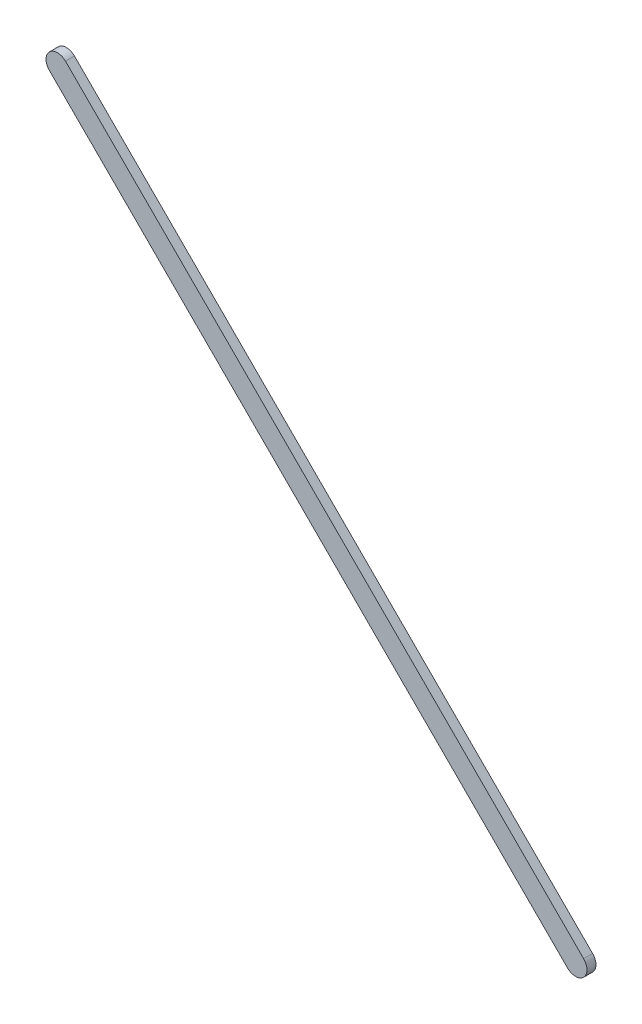
ISO-10303-21;
HEADER;
FILE_DESCRIPTION(('STEP AP214'),'2;1');
FILE_NAME('part.step','',(''),(''),'','','');
FILE_SCHEMA(('AUTOMOTIVE_DESIGN { 1 0 10303 214 1 1 1 1 }'));
ENDSEC;
DATA;
#1=APPLICATION_CONTEXT('core data for automotive mechanical design processes');
#2=APPLICATION_PROTOCOL_DEFINITION('international standard','automotive_design',2000,#1);
#3=PRODUCT_CONTEXT('',#1,'mechanical');
#4=PRODUCT('Part','Part','',(#3));
#5=PRODUCT_RELATED_PRODUCT_CATEGORY('part','',(#4));
#6=PRODUCT_DEFINITION_FORMATION('','',#4);
#7=PRODUCT_DEFINITION_CONTEXT('part definition',#1,'design');
#8=PRODUCT_DEFINITION('design','',#6,#7);
#9=PRODUCT_DEFINITION_SHAPE('','',#8);
#10=(LENGTH_UNIT() NAMED_UNIT(*) SI_UNIT(.MILLI.,.METRE.));
#11=(NAMED_UNIT(*) PLANE_ANGLE_UNIT() SI_UNIT($,.RADIAN.));
#12=(NAMED_UNIT(*) SI_UNIT($,.STERADIAN.) SOLID_ANGLE_UNIT());
#13=UNCERTAINTY_MEASURE_WITH_UNIT(LENGTH_MEASURE(1.E-05),#10,'distance_accuracy_value','');
#14=(GEOMETRIC_REPRESENTATION_CONTEXT(3) GLOBAL_UNCERTAINTY_ASSIGNED_CONTEXT((#13)) GLOBAL_UNIT_ASSIGNED_CONTEXT((#10,
#11,#12)) REPRESENTATION_CONTEXT('',''));
#15=CARTESIAN_POINT('',(0.,0.,0.));
#16=DIRECTION('',(0.,0.,1.));
#17=DIRECTION('',(1.,0.,0.));
#18=AXIS2_PLACEMENT_3D('',#15,#16,#17);
#19=CARTESIAN_POINT('',(118.03199406,65.19999406,0.));
#20=DIRECTION('',(0.707106781186548,0.707106781186547,0.));
#21=DIRECTION('',(0.707106781186547,-0.707106781186548,0.));
#22=AXIS2_PLACEMENT_3D('',#19,#20,#21);
#23=PLANE('',#22);
#24=DIRECTION('',(0.707106781186548,-0.707106781186548,0.));
#25=VECTOR('',#24,1.);
#26=CARTESIAN_POINT('',(118.03199406,65.19999406,0.1999996));
#27=LINE('',#26,#25);
#28=CARTESIAN_POINT('',(118.03199406,65.19999406,0.1999996));
#29=VERTEX_POINT('',#28);
#30=CARTESIAN_POINT('',(129.58899406,53.64299406,0.1999996));
#31=VERTEX_POINT('',#30);
#32=EDGE_CURVE('E11',#29,#31,#27,.T.);
#33=ORIENTED_EDGE('',*,*,#32,.F.);
#34=DIRECTION('',(0.,0.,1.));
#35=VECTOR('',#34,1.);
#36=CARTESIAN_POINT('',(118.03199406,65.19999406,0.));
#37=LINE('',#36,#35);
#38=CARTESIAN_POINT('',(118.03199406,65.19999406,0.));
#39=VERTEX_POINT('',#38);
#40=EDGE_CURVE('E24',#39,#29,#37,.T.);
#41=ORIENTED_EDGE('',*,*,#40,.F.);
#42=DIRECTION('',(0.707106781186548,-0.707106781186548,0.));
#43=VECTOR('',#42,1.);
#44=CARTESIAN_POINT('',(118.03199406,65.19999406,0.));
#45=LINE('',#44,#43);
#46=CARTESIAN_POINT('',(129.58899406,53.64299406,0.));
#47=VERTEX_POINT('',#46);
#48=EDGE_CURVE('E75',#39,#47,#45,.T.);
#49=ORIENTED_EDGE('',*,*,#48,.T.);
#50=DIRECTION('',(0.,0.,1.));
#51=VECTOR('',#50,1.);
#52=CARTESIAN_POINT('',(129.58899406,53.64299406,0.));
#53=LINE('',#52,#51);
#54=EDGE_CURVE('E37',#47,#31,#53,.T.);
#55=ORIENTED_EDGE('',*,*,#54,.T.);
#56=EDGE_LOOP('',(#33,#41,#49,#55));
#57=FACE_BOUND('',#56,.T.);
#58=ADVANCED_FACE('F17',(#57),#23,.F.);
#59=CARTESIAN_POINT('',(129.7686,53.8226,0.));
#60=DIRECTION('',(0.,0.,-1.));
#61=DIRECTION('',(-0.707106781186576,-0.70710678118652,0.));
#62=AXIS2_PLACEMENT_3D('',#59,#60,#61);
#63=CYLINDRICAL_SURFACE('',#62,0.254001156230768);
#64=CARTESIAN_POINT('',(129.7686,53.8226,0.1999996));
#65=DIRECTION('',(0.,0.,1.));
#66=DIRECTION('',(-0.707106781186576,-0.70710678118652,0.));
#67=AXIS2_PLACEMENT_3D('',#64,#65,#66);
#68=CIRCLE('',#67,0.254001156230768);
#69=CARTESIAN_POINT('',(129.94820594,54.00220594,0.1999996));
#70=VERTEX_POINT('',#69);
#71=EDGE_CURVE('E83',#31,#70,#68,.T.);
#72=ORIENTED_EDGE('',*,*,#71,.F.);
#73=ORIENTED_EDGE('',*,*,#54,.F.);
#74=CARTESIAN_POINT('',(129.7686,53.8226,0.));
#75=DIRECTION('',(0.,0.,1.));
#76=DIRECTION('',(-0.707106781186576,-0.70710678118652,0.));
#77=AXIS2_PLACEMENT_3D('',#74,#75,#76);
#78=CIRCLE('',#77,0.254001156230768);
#79=CARTESIAN_POINT('',(129.94820594,54.00220594,0.));
#80=VERTEX_POINT('',#79);
#81=EDGE_CURVE('E81',#47,#80,#78,.T.);
#82=ORIENTED_EDGE('',*,*,#81,.T.);
#83=DIRECTION('',(0.,0.,1.));
#84=VECTOR('',#83,1.);
#85=CARTESIAN_POINT('',(129.94820594,54.00220594,0.));
#86=LINE('',#85,#84);
#87=EDGE_CURVE('E67',#80,#70,#86,.T.);
#88=ORIENTED_EDGE('',*,*,#87,.T.);
#89=EDGE_LOOP('',(#72,#73,#82,#88));
#90=FACE_BOUND('',#89,.T.);
#91=ADVANCED_FACE('F89',(#90),#63,.T.);
#92=CARTESIAN_POINT('',(129.94820594,54.00220594,0.));
#93=DIRECTION('',(-0.707106781186548,-0.707106781186547,0.));
#94=DIRECTION('',(-0.707106781186547,0.707106781186548,0.));
#95=AXIS2_PLACEMENT_3D('',#92,#93,#94);
#96=PLANE('',#95);
#97=DIRECTION('',(-0.707106781186548,0.707106781186548,0.));
#98=VECTOR('',#97,1.);
#99=CARTESIAN_POINT('',(129.94820594,54.00220594,0.1999996));
#100=LINE('',#99,#98);
#101=CARTESIAN_POINT('',(118.39120594,65.55920594,0.1999996));
#102=VERTEX_POINT('',#101);
#103=EDGE_CURVE('E71',#70,#102,#100,.T.);
#104=ORIENTED_EDGE('',*,*,#103,.F.);
#105=ORIENTED_EDGE('',*,*,#87,.F.);
#106=DIRECTION('',(-0.707106781186548,0.707106781186548,0.));
#107=VECTOR('',#106,1.);
#108=CARTESIAN_POINT('',(129.94820594,54.00220594,0.));
#109=LINE('',#108,#107);
#110=CARTESIAN_POINT('',(118.39120594,65.55920594,0.));
#111=VERTEX_POINT('',#110);
#112=EDGE_CURVE('E63',#80,#111,#109,.T.);
#113=ORIENTED_EDGE('',*,*,#112,.T.);
#114=DIRECTION('',(0.,0.,1.));
#115=VECTOR('',#114,1.);
#116=CARTESIAN_POINT('',(118.39120594,65.55920594,0.));
#117=LINE('',#116,#115);
#118=EDGE_CURVE('E53',#111,#102,#117,.T.);
#119=ORIENTED_EDGE('',*,*,#118,.T.);
#120=EDGE_LOOP('',(#104,#105,#113,#119));
#121=FACE_BOUND('',#120,.T.);
#122=ADVANCED_FACE('F66',(#121),#96,.F.);
#123=CARTESIAN_POINT('',(118.2116,65.3796,0.));
#124=DIRECTION('',(0.,0.,-1.));
#125=DIRECTION('',(0.707106781186548,0.707106781186548,0.));
#126=AXIS2_PLACEMENT_3D('',#123,#124,#125);
#127=CYLINDRICAL_SURFACE('',#126,0.254001156230771);
#128=CARTESIAN_POINT('',(118.2116,65.3796,0.1999996));
#129=DIRECTION('',(0.,0.,1.));
#130=DIRECTION('',(0.707106781186548,0.707106781186548,0.));
#131=AXIS2_PLACEMENT_3D('',#128,#129,#130);
#132=CIRCLE('',#131,0.254001156230771);
#133=EDGE_CURVE('E59',#102,#29,#132,.T.);
#134=ORIENTED_EDGE('',*,*,#133,.F.);
#135=ORIENTED_EDGE('',*,*,#118,.F.);
#136=CARTESIAN_POINT('',(118.2116,65.3796,0.));
#137=DIRECTION('',(0.,0.,1.));
#138=DIRECTION('',(0.707106781186548,0.707106781186548,0.));
#139=AXIS2_PLACEMENT_3D('',#136,#137,#138);
#140=CIRCLE('',#139,0.254001156230771);
#141=EDGE_CURVE('E57',#111,#39,#140,.T.);
#142=ORIENTED_EDGE('',*,*,#141,.T.);
#143=ORIENTED_EDGE('',*,*,#40,.T.);
#144=EDGE_LOOP('',(#134,#135,#142,#143));
#145=FACE_BOUND('',#144,.T.);
#146=ADVANCED_FACE('F55',(#145),#127,.T.);
#147=CARTESIAN_POINT('',(118.03199406,65.19999406,0.));
#148=DIRECTION('',(0.,0.,-1.));
#149=DIRECTION('',(-1.,0.,0.));
#150=AXIS2_PLACEMENT_3D('',#147,#148,#149);
#151=PLANE('',#150);
#152=ORIENTED_EDGE('',*,*,#141,.F.);
#153=ORIENTED_EDGE('',*,*,#112,.F.);
#154=ORIENTED_EDGE('',*,*,#81,.F.);
#155=ORIENTED_EDGE('',*,*,#48,.F.);
#156=EDGE_LOOP('',(#152,#153,#154,#155));
#157=FACE_BOUND('',#156,.T.);
#158=ADVANCED_FACE('F74',(#157),#151,.T.);
#159=CARTESIAN_POINT('',(118.03199406,65.19999406,0.1999996));
#160=DIRECTION('',(0.,0.,-1.));
#161=DIRECTION('',(-1.,0.,0.));
#162=AXIS2_PLACEMENT_3D('',#159,#160,#161);
#163=PLANE('',#162);
#164=ORIENTED_EDGE('',*,*,#32,.T.);
#165=ORIENTED_EDGE('',*,*,#71,.T.);
#166=ORIENTED_EDGE('',*,*,#103,.T.);
#167=ORIENTED_EDGE('',*,*,#133,.T.);
#168=EDGE_LOOP('',(#164,#165,#166,#167));
#169=FACE_BOUND('',#168,.T.);
#170=ADVANCED_FACE('F91',(#169),#163,.F.);
#171=CLOSED_SHELL('',(#58,#91,#122,#146,#158,#170));
#172=MANIFOLD_SOLID_BREP('B1',#171);
#173=ADVANCED_BREP_SHAPE_REPRESENTATION('',(#18,#172),#14);
#174=SHAPE_DEFINITION_REPRESENTATION(#9,#173);
ENDSEC;
END-ISO-10303-21;
